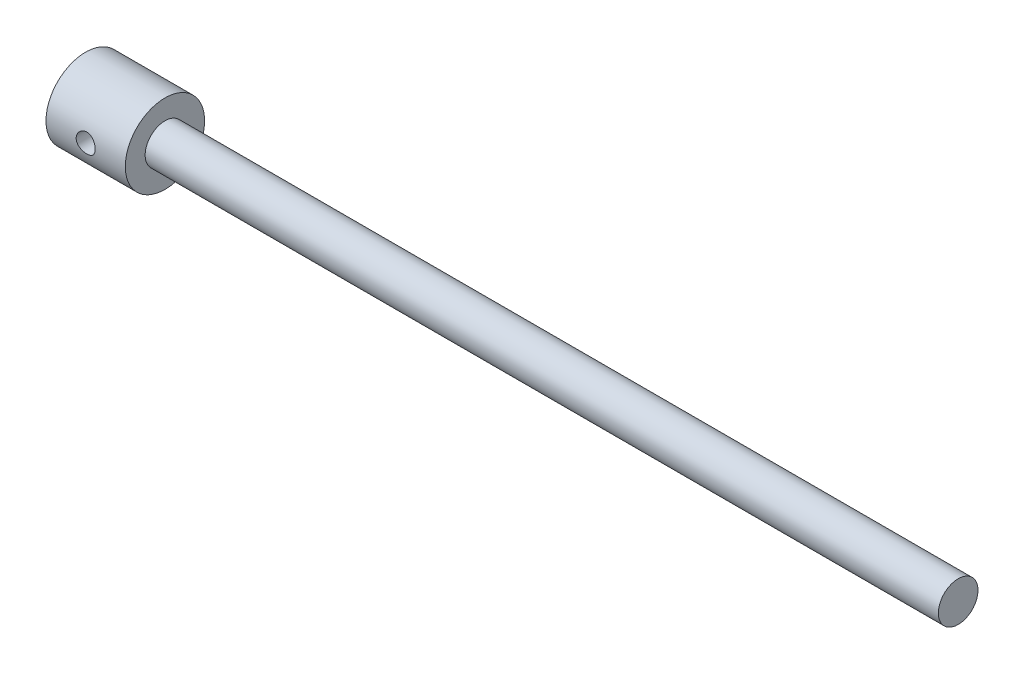
ISO-10303-21;
HEADER;
FILE_DESCRIPTION(('STEP AP214'),'2;1');
FILE_NAME('part.step','',(''),(''),'','','');
FILE_SCHEMA(('AUTOMOTIVE_DESIGN { 1 0 10303 214 1 1 1 1 }'));
ENDSEC;
DATA;
#1=APPLICATION_CONTEXT('core data for automotive mechanical design processes');
#2=APPLICATION_PROTOCOL_DEFINITION('international standard','automotive_design',2000,#1);
#3=PRODUCT_CONTEXT('',#1,'mechanical');
#4=PRODUCT('Part','Part','',(#3));
#5=PRODUCT_RELATED_PRODUCT_CATEGORY('part','',(#4));
#6=PRODUCT_DEFINITION_FORMATION('','',#4);
#7=PRODUCT_DEFINITION_CONTEXT('part definition',#1,'design');
#8=PRODUCT_DEFINITION('design','',#6,#7);
#9=PRODUCT_DEFINITION_SHAPE('','',#8);
#10=(LENGTH_UNIT() NAMED_UNIT(*) SI_UNIT(.MILLI.,.METRE.));
#11=(NAMED_UNIT(*) PLANE_ANGLE_UNIT() SI_UNIT($,.RADIAN.));
#12=(NAMED_UNIT(*) SI_UNIT($,.STERADIAN.) SOLID_ANGLE_UNIT());
#13=UNCERTAINTY_MEASURE_WITH_UNIT(LENGTH_MEASURE(1.E-05),#10,'distance_accuracy_value','');
#14=(GEOMETRIC_REPRESENTATION_CONTEXT(3) GLOBAL_UNCERTAINTY_ASSIGNED_CONTEXT((#13)) GLOBAL_UNIT_ASSIGNED_CONTEXT((#10,
#11,#12)) REPRESENTATION_CONTEXT('',''));
#15=CARTESIAN_POINT('',(0.,0.,0.));
#16=DIRECTION('',(0.,0.,1.));
#17=DIRECTION('',(1.,0.,0.));
#18=AXIS2_PLACEMENT_3D('',#15,#16,#17);
#19=CARTESIAN_POINT('',(275.,0.,0.));
#20=DIRECTION('',(-1.,0.,0.));
#21=DIRECTION('',(0.,0.,1.));
#22=AXIS2_PLACEMENT_3D('',#19,#20,#21);
#23=CYLINDRICAL_SURFACE('',#22,12.5);
#24=CARTESIAN_POINT('',(275.,0.,0.));
#25=DIRECTION('',(1.,0.,0.));
#26=DIRECTION('',(0.,0.,-1.));
#27=AXIS2_PLACEMENT_3D('',#24,#25,#26);
#28=CIRCLE('',#27,12.5);
#29=CARTESIAN_POINT('',(275.,0.,-12.5));
#30=VERTEX_POINT('',#29);
#31=EDGE_CURVE('E53',#30,#30,#28,.T.);
#32=ORIENTED_EDGE('',*,*,#31,.F.);
#33=EDGE_LOOP('',(#32));
#34=FACE_BOUND('',#33,.T.);
#35=CARTESIAN_POINT('',(-225.,0.,0.));
#36=DIRECTION('',(-1.,0.,0.));
#37=DIRECTION('',(0.,0.,1.));
#38=AXIS2_PLACEMENT_3D('',#35,#36,#37);
#39=CIRCLE('',#38,12.5);
#40=CARTESIAN_POINT('',(-225.,0.,12.5));
#41=VERTEX_POINT('',#40);
#42=EDGE_CURVE('E49',#41,#41,#39,.T.);
#43=ORIENTED_EDGE('',*,*,#42,.F.);
#44=EDGE_LOOP('',(#43));
#45=FACE_BOUND('',#44,.T.);
#46=ADVANCED_FACE('F37',(#34,#45),#23,.T.);
#47=CARTESIAN_POINT('',(275.,0.,0.));
#48=DIRECTION('',(1.,0.,0.));
#49=DIRECTION('',(0.,0.,-1.));
#50=AXIS2_PLACEMENT_3D('',#47,#48,#49);
#51=PLANE('',#50);
#52=ORIENTED_EDGE('',*,*,#31,.T.);
#53=EDGE_LOOP('',(#52));
#54=FACE_BOUND('',#53,.T.);
#55=ADVANCED_FACE('F77',(#54),#51,.T.);
#56=CARTESIAN_POINT('',(-225.,0.,0.));
#57=DIRECTION('',(-1.,0.,0.));
#58=DIRECTION('',(0.,0.,1.));
#59=AXIS2_PLACEMENT_3D('',#56,#57,#58);
#60=CYLINDRICAL_SURFACE('',#59,25.);
#61=CARTESIAN_POINT('',(-244.,0.,25.));
#62=CARTESIAN_POINT('',(-243.999995434598,0.166017736340745,25.0000026804997));
#63=CARTESIAN_POINT('',(-244.00689166849,0.331984064130572,24.9983437383731));
#64=CARTESIAN_POINT('',(-244.034409009947,0.662757375273787,24.9917601768854));
#65=CARTESIAN_POINT('',(-244.055031848283,0.827564209779567,24.9868351457074));
#66=CARTESIAN_POINT('',(-244.109846415167,1.15483168687375,24.9738504635424));
#67=CARTESIAN_POINT('',(-244.144042956597,1.31729147606248,24.9657897007271));
#68=CARTESIAN_POINT('',(-244.22573807923,1.63872050759382,24.9467537443302));
#69=CARTESIAN_POINT('',(-244.273241560201,1.79768844089952,24.9357774773038));
#70=CARTESIAN_POINT('',(-244.381084599963,2.11072366381166,24.9112316091515));
#71=CARTESIAN_POINT('',(-244.441404263237,2.26479812859839,24.897666030887));
#72=CARTESIAN_POINT('',(-244.574487349599,2.56731972417305,24.8682925860487));
#73=CARTESIAN_POINT('',(-244.647255365725,2.71576475309532,24.8524838922068));
#74=CARTESIAN_POINT('',(-244.804657090552,3.00593509691776,24.8190587739081));
#75=CARTESIAN_POINT('',(-244.889286274639,3.14766294672408,24.8014430394569));
#76=CARTESIAN_POINT('',(-245.069871239809,3.42359889441686,24.7648612187919));
#77=CARTESIAN_POINT('',(-245.165831272141,3.55780414185138,24.7458946268123));
#78=CARTESIAN_POINT('',(-245.370105499563,3.81996752921305,24.7067947855154));
#79=CARTESIAN_POINT('',(-245.478599862314,3.94778319107672,24.6866473068088));
#80=CARTESIAN_POINT('',(-245.705912354122,4.1939104375348,24.6460277155742));
#81=CARTESIAN_POINT('',(-245.824734297765,4.31221847908385,24.6255554853983));
#82=CARTESIAN_POINT('',(-246.071850864152,4.53846894982135,24.5848634527513));
#83=CARTESIAN_POINT('',(-246.200143000877,4.64641408237689,24.5646435856504));
#84=CARTESIAN_POINT('',(-246.465436867112,4.85128465634763,24.5250062264423));
#85=CARTESIAN_POINT('',(-246.602441793544,4.94820601608994,24.5055890332168));
#86=CARTESIAN_POINT('',(-246.886089058755,5.13151493088752,24.4678652790419));
#87=CARTESIAN_POINT('',(-247.032834921448,5.21774615640804,24.4495768107614));
#88=CARTESIAN_POINT('',(-247.333354182715,5.37754406139994,24.4149279468241));
#89=CARTESIAN_POINT('',(-247.48713020696,5.4511059593335,24.3985682798489));
#90=CARTESIAN_POINT('',(-247.80053223397,5.58492026214269,24.3682865029779));
#91=CARTESIAN_POINT('',(-247.960155354961,5.64517912327472,24.354363211339));
#92=CARTESIAN_POINT('',(-248.284147125475,5.7519580696736,24.3293636773731));
#93=CARTESIAN_POINT('',(-248.448517456241,5.79847322039684,24.3182884578029));
#94=CARTESIAN_POINT('',(-248.940800804161,5.91523377010969,24.2902598679583));
#95=CARTESIAN_POINT('',(-249.274125250886,5.96534620186164,24.2778811042379));
#96=CARTESIAN_POINT('',(-249.776475601756,5.9981989502115,24.2697663322526));
#97=CARTESIAN_POINT('',(-249.944385487369,6.00209048242325,24.2688053008257));
#98=CARTESIAN_POINT('',(-250.279946661259,5.99581246294928,24.2703574949623));
#99=CARTESIAN_POINT('',(-250.447597946641,5.98564275494966,24.2728707591485));
#100=CARTESIAN_POINT('',(-250.940764562036,5.93483975630033,24.285368999466));
#101=CARTESIAN_POINT('',(-251.26433890737,5.87440247397775,24.3001939850224));
#102=CARTESIAN_POINT('',(-251.896444859761,5.70184242669474,24.3412549446464));
#103=CARTESIAN_POINT('',(-252.204975468911,5.58971623816144,24.3674916745551));
#104=CARTESIAN_POINT('',(-252.801812311694,5.31588253494413,24.4286958367201));
#105=CARTESIAN_POINT('',(-253.089901246387,5.15371899452587,24.4637429965247));
#106=CARTESIAN_POINT('',(-253.635212661486,4.78473374953626,24.5385748778448));
#107=CARTESIAN_POINT('',(-253.892430123017,4.5779047988219,24.5783603675971));
#108=CARTESIAN_POINT('',(-254.375786122191,4.11902988641847,24.6594640880418));
#109=CARTESIAN_POINT('',(-254.6009339253,3.86594129003376,24.7007951674045));
#110=CARTESIAN_POINT('',(-255.005769712324,3.32511184695827,24.7793903091839));
#111=CARTESIAN_POINT('',(-255.185456513426,3.03737009894222,24.8166542657671));
#112=CARTESIAN_POINT('',(-255.494594368169,2.43405695507433,24.8830789940348));
#113=CARTESIAN_POINT('',(-255.623894894268,2.11840557448717,24.9122154123614));
#114=CARTESIAN_POINT('',(-255.827330176301,1.46899521159139,24.9589240940734));
#115=CARTESIAN_POINT('',(-255.901474635033,1.13523942521408,24.9764983913503));
#116=CARTESIAN_POINT('',(-255.99100412952,0.46757480082757,24.9978055089126));
#117=CARTESIAN_POINT('',(-256.007739803127,0.133856966575296,25.0018564268946));
#118=CARTESIAN_POINT('',(-255.985666448096,-0.531608768658084,24.9965614831509));
#119=CARTESIAN_POINT('',(-255.946862003436,-0.863356829944318,24.9872167270307));
#120=CARTESIAN_POINT('',(-255.815926114576,-1.51084514007901,24.9563832816127));
#121=CARTESIAN_POINT('',(-255.724522047641,-1.82674108394959,24.9350603275565));
#122=CARTESIAN_POINT('',(-255.491803349795,-2.43870667494969,24.8826669936479));
#123=CARTESIAN_POINT('',(-255.350483918359,-2.73477441187555,24.8515956762951));
#124=CARTESIAN_POINT('',(-255.019267825048,-3.30412273668563,24.7823820658762));
#125=CARTESIAN_POINT('',(-254.828602373031,-3.57694246966832,24.7441307708391));
#126=CARTESIAN_POINT('',(-254.40508233449,-4.08719914724011,24.6649871461435));
#127=CARTESIAN_POINT('',(-254.172221069265,-4.32463047973871,24.6240943990595));
#128=CARTESIAN_POINT('',(-253.664732875858,-4.76284500809666,24.5431489449983));
#129=CARTESIAN_POINT('',(-253.389284582089,-4.96268414096837,24.5031358001301));
#130=CARTESIAN_POINT('',(-252.807764320409,-5.31333575577367,24.4295058119813));
#131=CARTESIAN_POINT('',(-252.501693724506,-5.46415043292342,24.395888682328));
#132=CARTESIAN_POINT('',(-252.027406316014,-5.64963439053452,24.353347630646));
#133=CARTESIAN_POINT('',(-251.867193043385,-5.70458710242878,24.3405033891164));
#134=CARTESIAN_POINT('',(-251.542517979968,-5.80079732294279,24.317755202926));
#135=CARTESIAN_POINT('',(-251.378057812857,-5.84205998439172,24.3078501521252));
#136=CARTESIAN_POINT('',(-251.046082096771,-5.91053741786635,24.2912903166139));
#137=CARTESIAN_POINT('',(-250.878566448895,-5.93775173433047,24.2846356373073));
#138=CARTESIAN_POINT('',(-250.541733533145,-5.9778996520454,24.2747841701866));
#139=CARTESIAN_POINT('',(-250.372416346139,-5.99083389159897,24.2715872278157));
#140=CARTESIAN_POINT('',(-250.037751269488,-6.0021549959408,24.2687899616173));
#141=CARTESIAN_POINT('',(-249.872416715526,-6.00091722515413,24.2690968340135));
#142=CARTESIAN_POINT('',(-249.542456478065,-5.98480872784871,24.2730742483489));
#143=CARTESIAN_POINT('',(-249.377830779192,-5.96993829850502,24.2767447169658));
#144=CARTESIAN_POINT('',(-249.050445398434,-5.9266866105659,24.2873399112073));
#145=CARTESIAN_POINT('',(-248.887686013502,-5.89830323162517,24.294265147542));
#146=CARTESIAN_POINT('',(-248.565269798519,-5.82827196779407,24.311160826296));
#147=CARTESIAN_POINT('',(-248.40561189375,-5.78662876790755,24.3211301931022));
#148=CARTESIAN_POINT('',(-248.091192481029,-5.69063662986337,24.3437686465433));
#149=CARTESIAN_POINT('',(-247.936411372817,-5.63634876916801,24.3564247302984));
#150=CARTESIAN_POINT('',(-247.632046611861,-5.51539707483439,24.3840980883562));
#151=CARTESIAN_POINT('',(-247.482461170401,-5.44873755154828,24.3991145400161));
#152=CARTESIAN_POINT('',(-247.189337833084,-5.30348427217984,24.4310987091682));
#153=CARTESIAN_POINT('',(-247.045802651664,-5.22488523075196,24.4480672900111));
#154=CARTESIAN_POINT('',(-246.765808854831,-5.0563524309126,24.4834782828489));
#155=CARTESIAN_POINT('',(-246.629347916485,-4.9664224268935,24.5019202059306));
#156=CARTESIAN_POINT('',(-246.361049616708,-4.77346921711417,24.5402505889388));
#157=CARTESIAN_POINT('',(-246.22940766887,-4.67017903544835,24.5601634300573));
#158=CARTESIAN_POINT('',(-245.97529158151,-4.4530488048287,24.600458146359));
#159=CARTESIAN_POINT('',(-245.852814318877,-4.3392123796575,24.6208398586377));
#160=CARTESIAN_POINT('',(-245.617706887018,-4.10164015488732,24.661530300392));
#161=CARTESIAN_POINT('',(-245.505082573623,-3.97789855094999,24.6818389796797));
#162=CARTESIAN_POINT('',(-245.290551895242,-3.72142967770471,24.7218081005976));
#163=CARTESIAN_POINT('',(-245.188641633067,-3.58870570477299,24.7414687761375));
#164=CARTESIAN_POINT('',(-244.994576077505,-3.31280088827596,24.7799327781137));
#165=CARTESIAN_POINT('',(-244.902612751638,-3.16948213881108,24.7987162302532));
#166=CARTESIAN_POINT('',(-244.731146927712,-2.87543817634771,24.8345280560803));
#167=CARTESIAN_POINT('',(-244.651639844027,-2.72471571591035,24.8515570748485));
#168=CARTESIAN_POINT('',(-244.505687712852,-2.41692354679157,24.883375777664));
#169=CARTESIAN_POINT('',(-244.439236526656,-2.25985686316149,24.8981665133663));
#170=CARTESIAN_POINT('',(-244.319895727961,-1.94048744711082,24.9250921884147));
#171=CARTESIAN_POINT('',(-244.267003943724,-1.77818555787967,24.9372275530119));
#172=CARTESIAN_POINT('',(-244.147974826546,-1.35190448336008,24.9647957983314));
#173=CARTESIAN_POINT('',(-244.092575851509,-1.08469226075994,24.9779181465939));
#174=CARTESIAN_POINT('',(-244.018593355794,-0.544940331071907,24.9955177731159));
#175=CARTESIAN_POINT('',(-244.000007490886,-0.272400964328517,24.9999956018512));
#176=CARTESIAN_POINT('',(-244.,0.,25.));
#177=B_SPLINE_CURVE_WITH_KNOTS('',3,(#61,#62,#63,#64,#65,#66,#67,#68,#69,#70,#71,#72,#73,#74,
#75,#76,#77,#78,#79,#80,#81,#82,#83,#84,#85,#86,#87,#88,#89,#90,#91,#92,#93,#94,#95,#96,#97,#98,
#99,#100,#101,#102,#103,#104,#105,#106,#107,#108,#109,#110,#111,#112,#113,#114,#115,#116,#117,
#118,#119,#120,#121,#122,#123,#124,#125,#126,#127,#128,#129,#130,#131,#132,#133,#134,#135,#136,
#137,#138,#139,#140,#141,#142,#143,#144,#145,#146,#147,#148,#149,#150,#151,#152,#153,#154,#155,
#156,#157,#158,#159,#160,#161,#162,#163,#164,#165,#166,#167,#168,#169,#170,#171,#172,#173,#174,
#175,#176),.UNSPECIFIED.,.T.,.F.,(4,2,2,2,2,2,2,2,2,2,2,2,2,2,2,2,2,2,2,2,2,2,2,2,2,2,2,2,2,2,2,
2,2,2,2,2,2,2,2,2,2,2,2,2,2,2,2,2,2,2,2,2,2,2,2,2,2,4),(0.,0.497813360100956,0.99568950076975,
1.49374233325074,1.9919787960947,2.48944738770732,2.98709992652943,3.48456314269131,
3.98221359994715,4.48820831908742,4.99439073274953,5.50044073797182,6.00667750796931,
6.51961190143623,7.03273945954077,7.54561743540082,8.05867933189508,9.06463756237657,
9.56800871792688,10.0713854693235,11.0548629550303,12.0384055899336,13.0311908061743,
14.0241372047509,15.0430966233895,16.0620825507943,17.0840897493149,18.1059171185592,
19.1035329919674,20.1010665323702,21.0851262031471,22.069280539993,23.0698021185097,
24.070482196897,25.0936623603893,26.1167967016264,26.625864341406,27.1347401541085,
27.6436324676664,28.1525020334115,28.6479253897996,29.1433379468294,29.6388282657177,
30.134143710225,30.6271145113295,31.1199138801487,31.6129320389054,32.1057872688851,
32.6107272666005,33.1154944014542,33.6205595212517,34.1254402854415,34.6387770201078,
35.1519243293049,35.6648297831433,36.1776530362051,36.9945144051895,37.8113237554194),.UNSPECIFIED.);
#178=CARTESIAN_POINT('',(-244.,0.,25.));
#179=VERTEX_POINT('',#178);
#180=EDGE_CURVE('E40',#179,#179,#177,.T.);
#181=ORIENTED_EDGE('',*,*,#180,.F.);
#182=EDGE_LOOP('',(#181));
#183=FACE_BOUND('',#182,.T.);
#184=CARTESIAN_POINT('',(-244.,0.,-25.));
#185=CARTESIAN_POINT('',(-243.999995434598,-0.166017736340745,-25.0000026804997));
#186=CARTESIAN_POINT('',(-244.00689166849,-0.331984064130572,-24.9983437383731));
#187=CARTESIAN_POINT('',(-244.034409009947,-0.662757375273787,-24.9917601768854));
#188=CARTESIAN_POINT('',(-244.055031848283,-0.827564209779567,-24.9868351457074));
#189=CARTESIAN_POINT('',(-244.109846415167,-1.15483168687375,-24.9738504635424));
#190=CARTESIAN_POINT('',(-244.144042956597,-1.31729147606248,-24.9657897007271));
#191=CARTESIAN_POINT('',(-244.22573807923,-1.63872050759382,-24.9467537443302));
#192=CARTESIAN_POINT('',(-244.273241560201,-1.79768844089952,-24.9357774773038));
#193=CARTESIAN_POINT('',(-244.381084599963,-2.11072366381166,-24.9112316091515));
#194=CARTESIAN_POINT('',(-244.441404263237,-2.26479812859839,-24.897666030887));
#195=CARTESIAN_POINT('',(-244.574487349599,-2.56731972417305,-24.8682925860487));
#196=CARTESIAN_POINT('',(-244.647255365725,-2.71576475309532,-24.8524838922068));
#197=CARTESIAN_POINT('',(-244.804657090552,-3.00593509691776,-24.8190587739081));
#198=CARTESIAN_POINT('',(-244.889286274639,-3.14766294672408,-24.8014430394569));
#199=CARTESIAN_POINT('',(-245.069871239809,-3.42359889441686,-24.7648612187919));
#200=CARTESIAN_POINT('',(-245.165831272141,-3.55780414185138,-24.7458946268123));
#201=CARTESIAN_POINT('',(-245.370105499563,-3.81996752921305,-24.7067947855154));
#202=CARTESIAN_POINT('',(-245.478599862314,-3.94778319107672,-24.6866473068088));
#203=CARTESIAN_POINT('',(-245.705912354122,-4.1939104375348,-24.6460277155742));
#204=CARTESIAN_POINT('',(-245.824734297765,-4.31221847908385,-24.6255554853983));
#205=CARTESIAN_POINT('',(-246.071850864152,-4.53846894982135,-24.5848634527513));
#206=CARTESIAN_POINT('',(-246.200143000877,-4.64641408237689,-24.5646435856504));
#207=CARTESIAN_POINT('',(-246.465436867112,-4.85128465634763,-24.5250062264423));
#208=CARTESIAN_POINT('',(-246.602441793544,-4.94820601608994,-24.5055890332168));
#209=CARTESIAN_POINT('',(-246.886089058755,-5.13151493088752,-24.4678652790419));
#210=CARTESIAN_POINT('',(-247.032834921448,-5.21774615640804,-24.4495768107614));
#211=CARTESIAN_POINT('',(-247.333354182715,-5.37754406139994,-24.4149279468241));
#212=CARTESIAN_POINT('',(-247.48713020696,-5.4511059593335,-24.3985682798489));
#213=CARTESIAN_POINT('',(-247.80053223397,-5.58492026214269,-24.3682865029779));
#214=CARTESIAN_POINT('',(-247.960155354961,-5.64517912327472,-24.354363211339));
#215=CARTESIAN_POINT('',(-248.284147125475,-5.7519580696736,-24.3293636773731));
#216=CARTESIAN_POINT('',(-248.448517456241,-5.79847322039684,-24.3182884578029));
#217=CARTESIAN_POINT('',(-248.940800804161,-5.91523377010969,-24.2902598679583));
#218=CARTESIAN_POINT('',(-249.274125250886,-5.96534620186164,-24.2778811042379));
#219=CARTESIAN_POINT('',(-249.776475601756,-5.9981989502115,-24.2697663322526));
#220=CARTESIAN_POINT('',(-249.944385487369,-6.00209048242325,-24.2688053008257));
#221=CARTESIAN_POINT('',(-250.279946661259,-5.99581246294928,-24.2703574949623));
#222=CARTESIAN_POINT('',(-250.447597946641,-5.98564275494966,-24.2728707591485));
#223=CARTESIAN_POINT('',(-250.940764562036,-5.93483975630033,-24.285368999466));
#224=CARTESIAN_POINT('',(-251.26433890737,-5.87440247397775,-24.3001939850224));
#225=CARTESIAN_POINT('',(-251.896444859761,-5.70184242669474,-24.3412549446464));
#226=CARTESIAN_POINT('',(-252.204975468911,-5.58971623816144,-24.3674916745551));
#227=CARTESIAN_POINT('',(-252.801812311694,-5.31588253494413,-24.4286958367201));
#228=CARTESIAN_POINT('',(-253.089901246387,-5.15371899452587,-24.4637429965247));
#229=CARTESIAN_POINT('',(-253.635212661486,-4.78473374953626,-24.5385748778448));
#230=CARTESIAN_POINT('',(-253.892430123017,-4.5779047988219,-24.5783603675971));
#231=CARTESIAN_POINT('',(-254.375786122191,-4.11902988641847,-24.6594640880418));
#232=CARTESIAN_POINT('',(-254.6009339253,-3.86594129003376,-24.7007951674045));
#233=CARTESIAN_POINT('',(-255.005769712324,-3.32511184695827,-24.7793903091839));
#234=CARTESIAN_POINT('',(-255.185456513426,-3.03737009894222,-24.8166542657671));
#235=CARTESIAN_POINT('',(-255.494594368169,-2.43405695507433,-24.8830789940348));
#236=CARTESIAN_POINT('',(-255.623894894268,-2.11840557448717,-24.9122154123614));
#237=CARTESIAN_POINT('',(-255.827330176301,-1.46899521159139,-24.9589240940734));
#238=CARTESIAN_POINT('',(-255.901474635033,-1.13523942521408,-24.9764983913503));
#239=CARTESIAN_POINT('',(-255.99100412952,-0.46757480082757,-24.9978055089126));
#240=CARTESIAN_POINT('',(-256.007739803127,-0.133856966575296,-25.0018564268946));
#241=CARTESIAN_POINT('',(-255.985666448096,0.531608768658084,-24.9965614831509));
#242=CARTESIAN_POINT('',(-255.946862003436,0.863356829944318,-24.9872167270307));
#243=CARTESIAN_POINT('',(-255.815926114576,1.51084514007901,-24.9563832816127));
#244=CARTESIAN_POINT('',(-255.724522047641,1.82674108394959,-24.9350603275565));
#245=CARTESIAN_POINT('',(-255.491803349795,2.43870667494969,-24.8826669936479));
#246=CARTESIAN_POINT('',(-255.350483918359,2.73477441187555,-24.8515956762951));
#247=CARTESIAN_POINT('',(-255.019267825048,3.30412273668563,-24.7823820658762));
#248=CARTESIAN_POINT('',(-254.828602373031,3.57694246966832,-24.7441307708391));
#249=CARTESIAN_POINT('',(-254.40508233449,4.08719914724011,-24.6649871461435));
#250=CARTESIAN_POINT('',(-254.172221069265,4.32463047973871,-24.6240943990595));
#251=CARTESIAN_POINT('',(-253.664732875858,4.76284500809666,-24.5431489449983));
#252=CARTESIAN_POINT('',(-253.389284582089,4.96268414096837,-24.5031358001301));
#253=CARTESIAN_POINT('',(-252.807764320409,5.31333575577367,-24.4295058119813));
#254=CARTESIAN_POINT('',(-252.501693724506,5.46415043292342,-24.395888682328));
#255=CARTESIAN_POINT('',(-252.027406316014,5.64963439053452,-24.353347630646));
#256=CARTESIAN_POINT('',(-251.867193043385,5.70458710242878,-24.3405033891164));
#257=CARTESIAN_POINT('',(-251.542517979968,5.80079732294279,-24.317755202926));
#258=CARTESIAN_POINT('',(-251.378057812857,5.84205998439172,-24.3078501521252));
#259=CARTESIAN_POINT('',(-251.046082096771,5.91053741786635,-24.2912903166139));
#260=CARTESIAN_POINT('',(-250.878566448895,5.93775173433047,-24.2846356373073));
#261=CARTESIAN_POINT('',(-250.541733533145,5.9778996520454,-24.2747841701866));
#262=CARTESIAN_POINT('',(-250.372416346139,5.99083389159897,-24.2715872278157));
#263=CARTESIAN_POINT('',(-250.037751269488,6.0021549959408,-24.2687899616173));
#264=CARTESIAN_POINT('',(-249.872416715526,6.00091722515413,-24.2690968340135));
#265=CARTESIAN_POINT('',(-249.542456478065,5.98480872784871,-24.2730742483489));
#266=CARTESIAN_POINT('',(-249.377830779192,5.96993829850502,-24.2767447169658));
#267=CARTESIAN_POINT('',(-249.050445398434,5.9266866105659,-24.2873399112073));
#268=CARTESIAN_POINT('',(-248.887686013502,5.89830323162517,-24.294265147542));
#269=CARTESIAN_POINT('',(-248.565269798519,5.82827196779407,-24.311160826296));
#270=CARTESIAN_POINT('',(-248.40561189375,5.78662876790755,-24.3211301931022));
#271=CARTESIAN_POINT('',(-248.091192481029,5.69063662986337,-24.3437686465433));
#272=CARTESIAN_POINT('',(-247.936411372817,5.63634876916801,-24.3564247302984));
#273=CARTESIAN_POINT('',(-247.632046611861,5.51539707483439,-24.3840980883562));
#274=CARTESIAN_POINT('',(-247.482461170401,5.44873755154828,-24.3991145400161));
#275=CARTESIAN_POINT('',(-247.189337833084,5.30348427217984,-24.4310987091682));
#276=CARTESIAN_POINT('',(-247.045802651664,5.22488523075196,-24.4480672900111));
#277=CARTESIAN_POINT('',(-246.765808854831,5.0563524309126,-24.4834782828489));
#278=CARTESIAN_POINT('',(-246.629347916485,4.9664224268935,-24.5019202059306));
#279=CARTESIAN_POINT('',(-246.361049616708,4.77346921711417,-24.5402505889388));
#280=CARTESIAN_POINT('',(-246.22940766887,4.67017903544835,-24.5601634300573));
#281=CARTESIAN_POINT('',(-245.97529158151,4.4530488048287,-24.600458146359));
#282=CARTESIAN_POINT('',(-245.852814318877,4.3392123796575,-24.6208398586377));
#283=CARTESIAN_POINT('',(-245.617706887018,4.10164015488732,-24.661530300392));
#284=CARTESIAN_POINT('',(-245.505082573623,3.97789855094999,-24.6818389796797));
#285=CARTESIAN_POINT('',(-245.290551895242,3.72142967770471,-24.7218081005976));
#286=CARTESIAN_POINT('',(-245.188641633067,3.58870570477299,-24.7414687761375));
#287=CARTESIAN_POINT('',(-244.994576077505,3.31280088827596,-24.7799327781137));
#288=CARTESIAN_POINT('',(-244.902612751638,3.16948213881108,-24.7987162302532));
#289=CARTESIAN_POINT('',(-244.731146927712,2.87543817634771,-24.8345280560803));
#290=CARTESIAN_POINT('',(-244.651639844027,2.72471571591035,-24.8515570748485));
#291=CARTESIAN_POINT('',(-244.505687712852,2.41692354679157,-24.883375777664));
#292=CARTESIAN_POINT('',(-244.439236526656,2.25985686316149,-24.8981665133663));
#293=CARTESIAN_POINT('',(-244.319895727961,1.94048744711082,-24.9250921884147));
#294=CARTESIAN_POINT('',(-244.267003943724,1.77818555787967,-24.9372275530119));
#295=CARTESIAN_POINT('',(-244.147974826546,1.35190448336008,-24.9647957983314));
#296=CARTESIAN_POINT('',(-244.092575851509,1.08469226075994,-24.9779181465939));
#297=CARTESIAN_POINT('',(-244.018593355794,0.544940331071907,-24.9955177731159));
#298=CARTESIAN_POINT('',(-244.000007490886,0.272400964328517,-24.9999956018512));
#299=CARTESIAN_POINT('',(-244.,0.,-25.));
#300=B_SPLINE_CURVE_WITH_KNOTS('',3,(#184,#185,#186,#187,#188,#189,#190,#191,#192,#193,#194,
#195,#196,#197,#198,#199,#200,#201,#202,#203,#204,#205,#206,#207,#208,#209,#210,#211,#212,#213,
#214,#215,#216,#217,#218,#219,#220,#221,#222,#223,#224,#225,#226,#227,#228,#229,#230,#231,#232,
#233,#234,#235,#236,#237,#238,#239,#240,#241,#242,#243,#244,#245,#246,#247,#248,#249,#250,#251,
#252,#253,#254,#255,#256,#257,#258,#259,#260,#261,#262,#263,#264,#265,#266,#267,#268,#269,#270,
#271,#272,#273,#274,#275,#276,#277,#278,#279,#280,#281,#282,#283,#284,#285,#286,#287,#288,#289,
#290,#291,#292,#293,#294,#295,#296,#297,#298,#299),.UNSPECIFIED.,.T.,.F.,(4,2,2,2,2,2,2,2,2,2,2,
2,2,2,2,2,2,2,2,2,2,2,2,2,2,2,2,2,2,2,2,2,2,2,2,2,2,2,2,2,2,2,2,2,2,2,2,2,2,2,2,2,2,2,2,2,2,4),
(0.,0.497813360100956,0.99568950076975,1.49374233325074,1.9919787960947,2.48944738770732,
2.98709992652943,3.48456314269131,3.98221359994715,4.48820831908742,4.99439073274953,
5.50044073797182,6.00667750796931,6.51961190143623,7.03273945954077,7.54561743540082,
8.05867933189508,9.06463756237657,9.56800871792688,10.0713854693235,11.0548629550303,
12.0384055899336,13.0311908061743,14.0241372047509,15.0430966233895,16.0620825507943,
17.0840897493149,18.1059171185592,19.1035329919674,20.1010665323702,21.0851262031471,
22.069280539993,23.0698021185097,24.070482196897,25.0936623603893,26.1167967016264,
26.625864341406,27.1347401541085,27.6436324676664,28.1525020334115,28.6479253897996,
29.1433379468294,29.6388282657177,30.134143710225,30.6271145113295,31.1199138801487,
31.6129320389054,32.1057872688851,32.6107272666005,33.1154944014542,33.6205595212517,
34.1254402854415,34.6387770201078,35.1519243293049,35.6648297831433,36.1776530362051,
36.9945144051895,37.8113237554194),.UNSPECIFIED.);
#301=CARTESIAN_POINT('',(-244.,0.,-25.));
#302=VERTEX_POINT('',#301);
#303=EDGE_CURVE('E10',#302,#302,#300,.T.);
#304=ORIENTED_EDGE('',*,*,#303,.F.);
#305=EDGE_LOOP('',(#304));
#306=FACE_BOUND('',#305,.T.);
#307=CARTESIAN_POINT('',(-225.,0.,0.));
#308=DIRECTION('',(-1.,0.,0.));
#309=DIRECTION('',(0.,0.,1.));
#310=AXIS2_PLACEMENT_3D('',#307,#308,#309);
#311=CIRCLE('',#310,25.);
#312=CARTESIAN_POINT('',(-225.,0.,25.));
#313=VERTEX_POINT('',#312);
#314=EDGE_CURVE('E89',#313,#313,#311,.T.);
#315=ORIENTED_EDGE('',*,*,#314,.T.);
#316=EDGE_LOOP('',(#315));
#317=FACE_BOUND('',#316,.T.);
#318=CARTESIAN_POINT('',(-275.,0.,0.));
#319=DIRECTION('',(-1.,0.,0.));
#320=DIRECTION('',(0.,0.,1.));
#321=AXIS2_PLACEMENT_3D('',#318,#319,#320);
#322=CIRCLE('',#321,25.);
#323=CARTESIAN_POINT('',(-275.,0.,25.));
#324=VERTEX_POINT('',#323);
#325=EDGE_CURVE('E91',#324,#324,#322,.T.);
#326=ORIENTED_EDGE('',*,*,#325,.F.);
#327=EDGE_LOOP('',(#326));
#328=FACE_BOUND('',#327,.T.);
#329=ADVANCED_FACE('F59',(#183,#306,#317,#328),#60,.T.);
#330=CARTESIAN_POINT('',(-225.,0.,0.));
#331=DIRECTION('',(-1.,0.,0.));
#332=DIRECTION('',(0.,0.,1.));
#333=AXIS2_PLACEMENT_3D('',#330,#331,#332);
#334=PLANE('',#333);
#335=ORIENTED_EDGE('',*,*,#42,.T.);
#336=EDGE_LOOP('',(#335));
#337=FACE_BOUND('',#336,.T.);
#338=ORIENTED_EDGE('',*,*,#314,.F.);
#339=EDGE_LOOP('',(#338));
#340=FACE_BOUND('',#339,.T.);
#341=ADVANCED_FACE('F67',(#337,#340),#334,.F.);
#342=CARTESIAN_POINT('',(-275.,0.,0.));
#343=DIRECTION('',(1.,0.,0.));
#344=DIRECTION('',(0.,0.,-1.));
#345=AXIS2_PLACEMENT_3D('',#342,#343,#344);
#346=PLANE('',#345);
#347=ORIENTED_EDGE('',*,*,#325,.T.);
#348=EDGE_LOOP('',(#347));
#349=FACE_BOUND('',#348,.T.);
#350=ADVANCED_FACE('F66',(#349),#346,.F.);
#351=CARTESIAN_POINT('',(-250.,0.,-25.));
#352=DIRECTION('',(0.,0.,1.));
#353=DIRECTION('',(1.,0.,0.));
#354=AXIS2_PLACEMENT_3D('',#351,#352,#353);
#355=CYLINDRICAL_SURFACE('',#354,6.00000000000002);
#356=ORIENTED_EDGE('',*,*,#303,.T.);
#357=EDGE_LOOP('',(#356));
#358=FACE_BOUND('',#357,.T.);
#359=ORIENTED_EDGE('',*,*,#180,.T.);
#360=EDGE_LOOP('',(#359));
#361=FACE_BOUND('',#360,.T.);
#362=ADVANCED_FACE('F63',(#358,#361),#355,.F.);
#363=CLOSED_SHELL('',(#46,#55,#329,#341,#350,#362));
#364=MANIFOLD_SOLID_BREP('B2',#363);
#365=ADVANCED_BREP_SHAPE_REPRESENTATION('',(#18,#364),#14);
#366=SHAPE_DEFINITION_REPRESENTATION(#9,#365);
ENDSEC;
END-ISO-10303-21;
